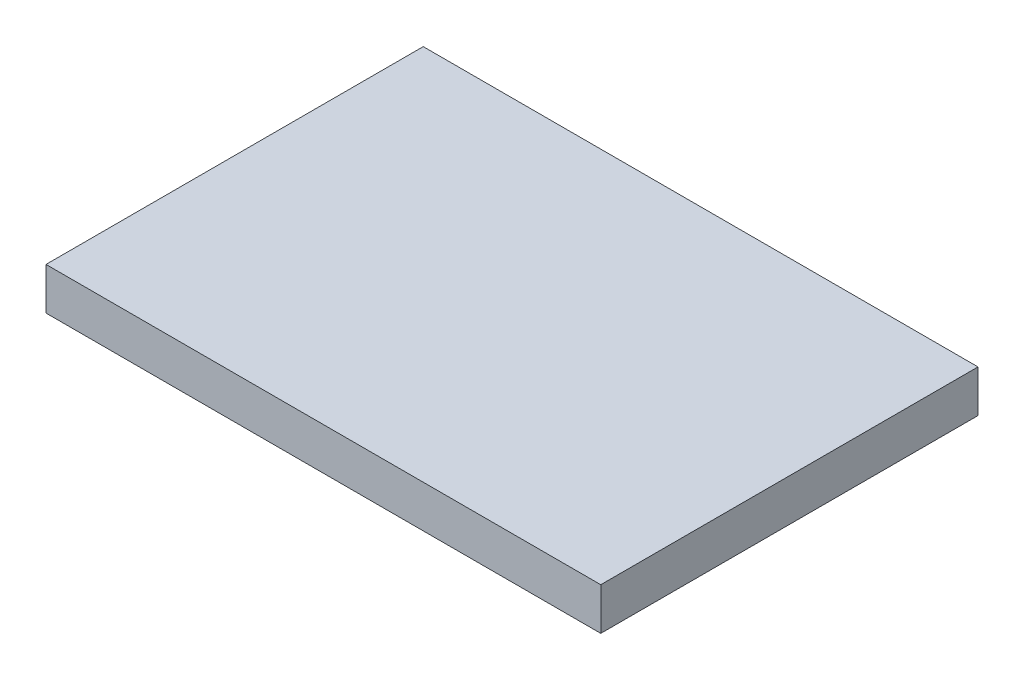
ISO-10303-21;
HEADER;
FILE_DESCRIPTION(('STEP AP214'),'2;1');
FILE_NAME('part.step','',(''),(''),'','','');
FILE_SCHEMA(('AUTOMOTIVE_DESIGN { 1 0 10303 214 1 1 1 1 }'));
ENDSEC;
DATA;
#1=APPLICATION_CONTEXT('core data for automotive mechanical design processes');
#2=APPLICATION_PROTOCOL_DEFINITION('international standard','automotive_design',2000,#1);
#3=PRODUCT_CONTEXT('',#1,'mechanical');
#4=PRODUCT('Part','Part','',(#3));
#5=PRODUCT_RELATED_PRODUCT_CATEGORY('part','',(#4));
#6=PRODUCT_DEFINITION_FORMATION('','',#4);
#7=PRODUCT_DEFINITION_CONTEXT('part definition',#1,'design');
#8=PRODUCT_DEFINITION('design','',#6,#7);
#9=PRODUCT_DEFINITION_SHAPE('','',#8);
#10=(LENGTH_UNIT() NAMED_UNIT(*) SI_UNIT(.MILLI.,.METRE.));
#11=(NAMED_UNIT(*) PLANE_ANGLE_UNIT() SI_UNIT($,.RADIAN.));
#12=(NAMED_UNIT(*) SI_UNIT($,.STERADIAN.) SOLID_ANGLE_UNIT());
#13=UNCERTAINTY_MEASURE_WITH_UNIT(LENGTH_MEASURE(1.E-05),#10,'distance_accuracy_value','');
#14=(GEOMETRIC_REPRESENTATION_CONTEXT(3) GLOBAL_UNCERTAINTY_ASSIGNED_CONTEXT((#13)) GLOBAL_UNIT_ASSIGNED_CONTEXT((#10,
#11,#12)) REPRESENTATION_CONTEXT('',''));
#15=CARTESIAN_POINT('',(0.,0.,0.));
#16=DIRECTION('',(0.,0.,1.));
#17=DIRECTION('',(1.,0.,0.));
#18=AXIS2_PLACEMENT_3D('',#15,#16,#17);
#19=CARTESIAN_POINT('',(0.,3.8,0.));
#20=DIRECTION('',(1.,0.,0.));
#21=DIRECTION('',(0.,0.,-1.));
#22=AXIS2_PLACEMENT_3D('',#19,#20,#21);
#23=PLANE('',#22);
#24=DIRECTION('',(0.,0.,1.));
#25=VECTOR('',#24,1.);
#26=CARTESIAN_POINT('',(0.,0.,0.));
#27=LINE('',#26,#25);
#28=CARTESIAN_POINT('',(0.,0.,-34.));
#29=VERTEX_POINT('',#28);
#30=CARTESIAN_POINT('',(0.,0.,0.));
#31=VERTEX_POINT('',#30);
#32=EDGE_CURVE('E96',#29,#31,#27,.T.);
#33=ORIENTED_EDGE('',*,*,#32,.T.);
#34=DIRECTION('',(0.,-1.,0.));
#35=VECTOR('',#34,1.);
#36=CARTESIAN_POINT('',(0.,3.8,0.));
#37=LINE('',#36,#35);
#38=CARTESIAN_POINT('',(0.,3.8,0.));
#39=VERTEX_POINT('',#38);
#40=EDGE_CURVE('E11',#39,#31,#37,.T.);
#41=ORIENTED_EDGE('',*,*,#40,.F.);
#42=DIRECTION('',(0.,0.,1.));
#43=VECTOR('',#42,1.);
#44=CARTESIAN_POINT('',(0.,3.8,0.));
#45=LINE('',#44,#43);
#46=CARTESIAN_POINT('',(0.,3.8,-34.));
#47=VERTEX_POINT('',#46);
#48=EDGE_CURVE('E84',#47,#39,#45,.T.);
#49=ORIENTED_EDGE('',*,*,#48,.F.);
#50=DIRECTION('',(0.,-1.,0.));
#51=VECTOR('',#50,1.);
#52=CARTESIAN_POINT('',(0.,3.8,-34.));
#53=LINE('',#52,#51);
#54=EDGE_CURVE('E92',#47,#29,#53,.T.);
#55=ORIENTED_EDGE('',*,*,#54,.T.);
#56=EDGE_LOOP('',(#33,#41,#49,#55));
#57=FACE_BOUND('',#56,.T.);
#58=ADVANCED_FACE('F33',(#57),#23,.F.);
#59=CARTESIAN_POINT('',(0.,3.8,0.));
#60=DIRECTION('',(0.,0.,-1.));
#61=DIRECTION('',(-1.,0.,0.));
#62=AXIS2_PLACEMENT_3D('',#59,#60,#61);
#63=PLANE('',#62);
#64=DIRECTION('',(1.,0.,0.));
#65=VECTOR('',#64,1.);
#66=CARTESIAN_POINT('',(0.,0.,0.));
#67=LINE('',#66,#65);
#68=CARTESIAN_POINT('',(50.,0.,0.));
#69=VERTEX_POINT('',#68);
#70=EDGE_CURVE('E88',#31,#69,#67,.T.);
#71=ORIENTED_EDGE('',*,*,#70,.T.);
#72=DIRECTION('',(0.,-1.,0.));
#73=VECTOR('',#72,1.);
#74=CARTESIAN_POINT('',(50.,3.8,0.));
#75=LINE('',#74,#73);
#76=CARTESIAN_POINT('',(50.,3.8,0.));
#77=VERTEX_POINT('',#76);
#78=EDGE_CURVE('E41',#77,#69,#75,.T.);
#79=ORIENTED_EDGE('',*,*,#78,.F.);
#80=DIRECTION('',(1.,0.,0.));
#81=VECTOR('',#80,1.);
#82=CARTESIAN_POINT('',(0.,3.8,0.));
#83=LINE('',#82,#81);
#84=EDGE_CURVE('E79',#39,#77,#83,.T.);
#85=ORIENTED_EDGE('',*,*,#84,.F.);
#86=ORIENTED_EDGE('',*,*,#40,.T.);
#87=EDGE_LOOP('',(#71,#79,#85,#86));
#88=FACE_BOUND('',#87,.T.);
#89=ADVANCED_FACE('F87',(#88),#63,.F.);
#90=CARTESIAN_POINT('',(50.,3.8,0.));
#91=DIRECTION('',(-1.,0.,0.));
#92=DIRECTION('',(0.,0.,1.));
#93=AXIS2_PLACEMENT_3D('',#90,#91,#92);
#94=PLANE('',#93);
#95=DIRECTION('',(0.,0.,-1.));
#96=VECTOR('',#95,1.);
#97=CARTESIAN_POINT('',(50.,0.,0.));
#98=LINE('',#97,#96);
#99=CARTESIAN_POINT('',(50.,0.,-34.));
#100=VERTEX_POINT('',#99);
#101=EDGE_CURVE('E66',#69,#100,#98,.T.);
#102=ORIENTED_EDGE('',*,*,#101,.T.);
#103=DIRECTION('',(0.,-1.,0.));
#104=VECTOR('',#103,1.);
#105=CARTESIAN_POINT('',(50.,3.8,-34.));
#106=LINE('',#105,#104);
#107=CARTESIAN_POINT('',(50.,3.8,-34.));
#108=VERTEX_POINT('',#107);
#109=EDGE_CURVE('E89',#108,#100,#106,.T.);
#110=ORIENTED_EDGE('',*,*,#109,.F.);
#111=DIRECTION('',(0.,0.,-1.));
#112=VECTOR('',#111,1.);
#113=CARTESIAN_POINT('',(50.,3.8,0.));
#114=LINE('',#113,#112);
#115=EDGE_CURVE('E82',#77,#108,#114,.T.);
#116=ORIENTED_EDGE('',*,*,#115,.F.);
#117=ORIENTED_EDGE('',*,*,#78,.T.);
#118=EDGE_LOOP('',(#102,#110,#116,#117));
#119=FACE_BOUND('',#118,.T.);
#120=ADVANCED_FACE('F90',(#119),#94,.F.);
#121=CARTESIAN_POINT('',(0.,3.8,-34.));
#122=DIRECTION('',(0.,0.,1.));
#123=DIRECTION('',(1.,0.,0.));
#124=AXIS2_PLACEMENT_3D('',#121,#122,#123);
#125=PLANE('',#124);
#126=DIRECTION('',(-1.,0.,0.));
#127=VECTOR('',#126,1.);
#128=CARTESIAN_POINT('',(0.,0.,-34.));
#129=LINE('',#128,#127);
#130=EDGE_CURVE('E72',#100,#29,#129,.T.);
#131=ORIENTED_EDGE('',*,*,#130,.T.);
#132=ORIENTED_EDGE('',*,*,#54,.F.);
#133=DIRECTION('',(-1.,0.,0.));
#134=VECTOR('',#133,1.);
#135=CARTESIAN_POINT('',(0.,3.8,-34.));
#136=LINE('',#135,#134);
#137=EDGE_CURVE('E49',#108,#47,#136,.T.);
#138=ORIENTED_EDGE('',*,*,#137,.F.);
#139=ORIENTED_EDGE('',*,*,#109,.T.);
#140=EDGE_LOOP('',(#131,#132,#138,#139));
#141=FACE_BOUND('',#140,.T.);
#142=ADVANCED_FACE('F103',(#141),#125,.F.);
#143=CARTESIAN_POINT('',(0.,3.8,0.));
#144=DIRECTION('',(0.,-1.,0.));
#145=DIRECTION('',(0.,0.,-1.));
#146=AXIS2_PLACEMENT_3D('',#143,#144,#145);
#147=PLANE('',#146);
#148=ORIENTED_EDGE('',*,*,#48,.T.);
#149=ORIENTED_EDGE('',*,*,#84,.T.);
#150=ORIENTED_EDGE('',*,*,#115,.T.);
#151=ORIENTED_EDGE('',*,*,#137,.T.);
#152=EDGE_LOOP('',(#148,#149,#150,#151));
#153=FACE_BOUND('',#152,.T.);
#154=ADVANCED_FACE('F80',(#153),#147,.F.);
#155=CARTESIAN_POINT('',(0.,0.,0.));
#156=DIRECTION('',(0.,-1.,0.));
#157=DIRECTION('',(0.,0.,-1.));
#158=AXIS2_PLACEMENT_3D('',#155,#156,#157);
#159=PLANE('',#158);
#160=ORIENTED_EDGE('',*,*,#32,.F.);
#161=ORIENTED_EDGE('',*,*,#130,.F.);
#162=ORIENTED_EDGE('',*,*,#101,.F.);
#163=ORIENTED_EDGE('',*,*,#70,.F.);
#164=EDGE_LOOP('',(#160,#161,#162,#163));
#165=FACE_BOUND('',#164,.T.);
#166=ADVANCED_FACE('F106',(#165),#159,.T.);
#167=CLOSED_SHELL('',(#58,#89,#120,#142,#154,#166));
#168=MANIFOLD_SOLID_BREP('B2',#167);
#169=ADVANCED_BREP_SHAPE_REPRESENTATION('',(#18,#168),#14);
#170=SHAPE_DEFINITION_REPRESENTATION(#9,#169);
ENDSEC;
END-ISO-10303-21;
